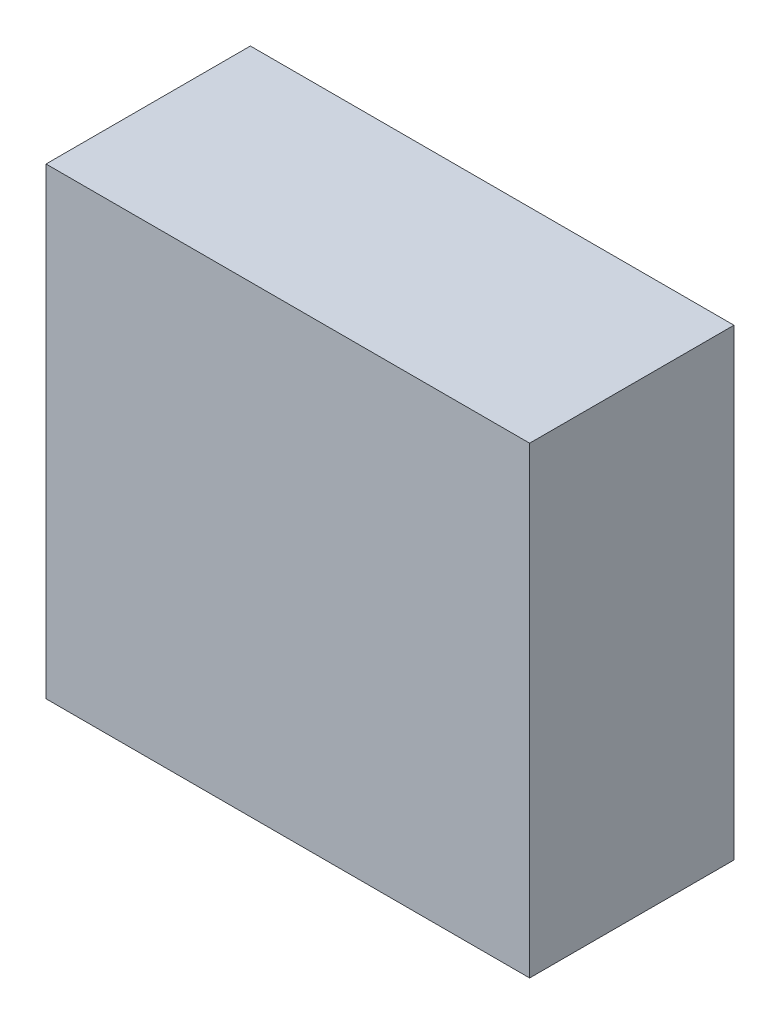
ISO-10303-21;
HEADER;
FILE_DESCRIPTION(('STEP AP214'),'2;1');
FILE_NAME('part.step','',(''),(''),'','','');
FILE_SCHEMA(('AUTOMOTIVE_DESIGN { 1 0 10303 214 1 1 1 1 }'));
ENDSEC;
DATA;
#1=APPLICATION_CONTEXT('core data for automotive mechanical design processes');
#2=APPLICATION_PROTOCOL_DEFINITION('international standard','automotive_design',2000,#1);
#3=PRODUCT_CONTEXT('',#1,'mechanical');
#4=PRODUCT('Part','Part','',(#3));
#5=PRODUCT_RELATED_PRODUCT_CATEGORY('part','',(#4));
#6=PRODUCT_DEFINITION_FORMATION('','',#4);
#7=PRODUCT_DEFINITION_CONTEXT('part definition',#1,'design');
#8=PRODUCT_DEFINITION('design','',#6,#7);
#9=PRODUCT_DEFINITION_SHAPE('','',#8);
#10=(LENGTH_UNIT() NAMED_UNIT(*) SI_UNIT(.MILLI.,.METRE.));
#11=(NAMED_UNIT(*) PLANE_ANGLE_UNIT() SI_UNIT($,.RADIAN.));
#12=(NAMED_UNIT(*) SI_UNIT($,.STERADIAN.) SOLID_ANGLE_UNIT());
#13=UNCERTAINTY_MEASURE_WITH_UNIT(LENGTH_MEASURE(1.E-05),#10,'distance_accuracy_value','');
#14=(GEOMETRIC_REPRESENTATION_CONTEXT(3) GLOBAL_UNCERTAINTY_ASSIGNED_CONTEXT((#13)) GLOBAL_UNIT_ASSIGNED_CONTEXT((#10,
#11,#12)) REPRESENTATION_CONTEXT('',''));
#15=CARTESIAN_POINT('',(0.,0.,0.));
#16=DIRECTION('',(0.,0.,1.));
#17=DIRECTION('',(1.,0.,0.));
#18=AXIS2_PLACEMENT_3D('',#15,#16,#17);
#19=CARTESIAN_POINT('',(90.1699999999999,172.72,38.1));
#20=DIRECTION('',(-1.,0.,0.));
#21=DIRECTION('',(0.,0.,1.));
#22=AXIS2_PLACEMENT_3D('',#19,#20,#21);
#23=PLANE('',#22);
#24=DIRECTION('',(0.,0.,-1.));
#25=VECTOR('',#24,1.);
#26=CARTESIAN_POINT('',(90.1699999999999,0.,38.1));
#27=LINE('',#26,#25);
#28=CARTESIAN_POINT('',(90.1699999999999,0.,38.1));
#29=VERTEX_POINT('',#28);
#30=CARTESIAN_POINT('',(90.1699999999999,0.,-38.1));
#31=VERTEX_POINT('',#30);
#32=EDGE_CURVE('E95',#29,#31,#27,.T.);
#33=ORIENTED_EDGE('',*,*,#32,.T.);
#34=DIRECTION('',(0.,-1.,0.));
#35=VECTOR('',#34,1.);
#36=CARTESIAN_POINT('',(90.1699999999999,172.72,-38.1));
#37=LINE('',#36,#35);
#38=CARTESIAN_POINT('',(90.1699999999999,172.72,-38.1));
#39=VERTEX_POINT('',#38);
#40=EDGE_CURVE('E11',#39,#31,#37,.T.);
#41=ORIENTED_EDGE('',*,*,#40,.F.);
#42=DIRECTION('',(0.,0.,-1.));
#43=VECTOR('',#42,1.);
#44=CARTESIAN_POINT('',(90.1699999999999,172.72,38.1));
#45=LINE('',#44,#43);
#46=CARTESIAN_POINT('',(90.1699999999999,172.72,38.1));
#47=VERTEX_POINT('',#46);
#48=EDGE_CURVE('E83',#47,#39,#45,.T.);
#49=ORIENTED_EDGE('',*,*,#48,.F.);
#50=DIRECTION('',(0.,-1.,0.));
#51=VECTOR('',#50,1.);
#52=CARTESIAN_POINT('',(90.1699999999999,172.72,38.1));
#53=LINE('',#52,#51);
#54=EDGE_CURVE('E91',#47,#29,#53,.T.);
#55=ORIENTED_EDGE('',*,*,#54,.T.);
#56=EDGE_LOOP('',(#33,#41,#49,#55));
#57=FACE_BOUND('',#56,.T.);
#58=ADVANCED_FACE('F32',(#57),#23,.F.);
#59=CARTESIAN_POINT('',(-90.1700000000001,172.72,-38.1));
#60=DIRECTION('',(0.,0.,1.));
#61=DIRECTION('',(1.,0.,0.));
#62=AXIS2_PLACEMENT_3D('',#59,#60,#61);
#63=PLANE('',#62);
#64=DIRECTION('',(-1.,0.,0.));
#65=VECTOR('',#64,1.);
#66=CARTESIAN_POINT('',(-90.1700000000001,0.,-38.1));
#67=LINE('',#66,#65);
#68=CARTESIAN_POINT('',(-90.1700000000001,0.,-38.1));
#69=VERTEX_POINT('',#68);
#70=EDGE_CURVE('E87',#31,#69,#67,.T.);
#71=ORIENTED_EDGE('',*,*,#70,.T.);
#72=DIRECTION('',(0.,-1.,0.));
#73=VECTOR('',#72,1.);
#74=CARTESIAN_POINT('',(-90.1700000000001,172.72,-38.1));
#75=LINE('',#74,#73);
#76=CARTESIAN_POINT('',(-90.1700000000001,172.72,-38.1));
#77=VERTEX_POINT('',#76);
#78=EDGE_CURVE('E40',#77,#69,#75,.T.);
#79=ORIENTED_EDGE('',*,*,#78,.F.);
#80=DIRECTION('',(-1.,0.,0.));
#81=VECTOR('',#80,1.);
#82=CARTESIAN_POINT('',(-90.1700000000001,172.72,-38.1));
#83=LINE('',#82,#81);
#84=EDGE_CURVE('E78',#39,#77,#83,.T.);
#85=ORIENTED_EDGE('',*,*,#84,.F.);
#86=ORIENTED_EDGE('',*,*,#40,.T.);
#87=EDGE_LOOP('',(#71,#79,#85,#86));
#88=FACE_BOUND('',#87,.T.);
#89=ADVANCED_FACE('F86',(#88),#63,.F.);
#90=CARTESIAN_POINT('',(-90.1700000000001,172.72,38.1));
#91=DIRECTION('',(1.,0.,0.));
#92=DIRECTION('',(0.,0.,-1.));
#93=AXIS2_PLACEMENT_3D('',#90,#91,#92);
#94=PLANE('',#93);
#95=DIRECTION('',(0.,0.,1.));
#96=VECTOR('',#95,1.);
#97=CARTESIAN_POINT('',(-90.1700000000001,0.,38.1));
#98=LINE('',#97,#96);
#99=CARTESIAN_POINT('',(-90.1700000000001,0.,38.1));
#100=VERTEX_POINT('',#99);
#101=EDGE_CURVE('E65',#69,#100,#98,.T.);
#102=ORIENTED_EDGE('',*,*,#101,.T.);
#103=DIRECTION('',(0.,-1.,0.));
#104=VECTOR('',#103,1.);
#105=CARTESIAN_POINT('',(-90.1700000000001,172.72,38.1));
#106=LINE('',#105,#104);
#107=CARTESIAN_POINT('',(-90.1700000000001,172.72,38.1));
#108=VERTEX_POINT('',#107);
#109=EDGE_CURVE('E88',#108,#100,#106,.T.);
#110=ORIENTED_EDGE('',*,*,#109,.F.);
#111=DIRECTION('',(0.,0.,1.));
#112=VECTOR('',#111,1.);
#113=CARTESIAN_POINT('',(-90.1700000000001,172.72,38.1));
#114=LINE('',#113,#112);
#115=EDGE_CURVE('E81',#77,#108,#114,.T.);
#116=ORIENTED_EDGE('',*,*,#115,.F.);
#117=ORIENTED_EDGE('',*,*,#78,.T.);
#118=EDGE_LOOP('',(#102,#110,#116,#117));
#119=FACE_BOUND('',#118,.T.);
#120=ADVANCED_FACE('F89',(#119),#94,.F.);
#121=CARTESIAN_POINT('',(-90.1700000000001,172.72,38.1));
#122=DIRECTION('',(0.,0.,-1.));
#123=DIRECTION('',(-1.,0.,0.));
#124=AXIS2_PLACEMENT_3D('',#121,#122,#123);
#125=PLANE('',#124);
#126=DIRECTION('',(1.,0.,0.));
#127=VECTOR('',#126,1.);
#128=CARTESIAN_POINT('',(-90.1700000000001,0.,38.1));
#129=LINE('',#128,#127);
#130=EDGE_CURVE('E71',#100,#29,#129,.T.);
#131=ORIENTED_EDGE('',*,*,#130,.T.);
#132=ORIENTED_EDGE('',*,*,#54,.F.);
#133=DIRECTION('',(1.,0.,0.));
#134=VECTOR('',#133,1.);
#135=CARTESIAN_POINT('',(-90.1700000000001,172.72,38.1));
#136=LINE('',#135,#134);
#137=EDGE_CURVE('E48',#108,#47,#136,.T.);
#138=ORIENTED_EDGE('',*,*,#137,.F.);
#139=ORIENTED_EDGE('',*,*,#109,.T.);
#140=EDGE_LOOP('',(#131,#132,#138,#139));
#141=FACE_BOUND('',#140,.T.);
#142=ADVANCED_FACE('F102',(#141),#125,.F.);
#143=CARTESIAN_POINT('',(0.,172.72,0.));
#144=DIRECTION('',(0.,-1.,0.));
#145=DIRECTION('',(0.,0.,-1.));
#146=AXIS2_PLACEMENT_3D('',#143,#144,#145);
#147=PLANE('',#146);
#148=ORIENTED_EDGE('',*,*,#48,.T.);
#149=ORIENTED_EDGE('',*,*,#84,.T.);
#150=ORIENTED_EDGE('',*,*,#115,.T.);
#151=ORIENTED_EDGE('',*,*,#137,.T.);
#152=EDGE_LOOP('',(#148,#149,#150,#151));
#153=FACE_BOUND('',#152,.T.);
#154=ADVANCED_FACE('F79',(#153),#147,.F.);
#155=CARTESIAN_POINT('',(0.,0.,0.));
#156=DIRECTION('',(0.,-1.,0.));
#157=DIRECTION('',(0.,0.,-1.));
#158=AXIS2_PLACEMENT_3D('',#155,#156,#157);
#159=PLANE('',#158);
#160=ORIENTED_EDGE('',*,*,#32,.F.);
#161=ORIENTED_EDGE('',*,*,#130,.F.);
#162=ORIENTED_EDGE('',*,*,#101,.F.);
#163=ORIENTED_EDGE('',*,*,#70,.F.);
#164=EDGE_LOOP('',(#160,#161,#162,#163));
#165=FACE_BOUND('',#164,.T.);
#166=ADVANCED_FACE('F105',(#165),#159,.T.);
#167=CLOSED_SHELL('',(#58,#89,#120,#142,#154,#166));
#168=MANIFOLD_SOLID_BREP('B2',#167);
#169=ADVANCED_BREP_SHAPE_REPRESENTATION('',(#18,#168),#14);
#170=SHAPE_DEFINITION_REPRESENTATION(#9,#169);
ENDSEC;
END-ISO-10303-21;
